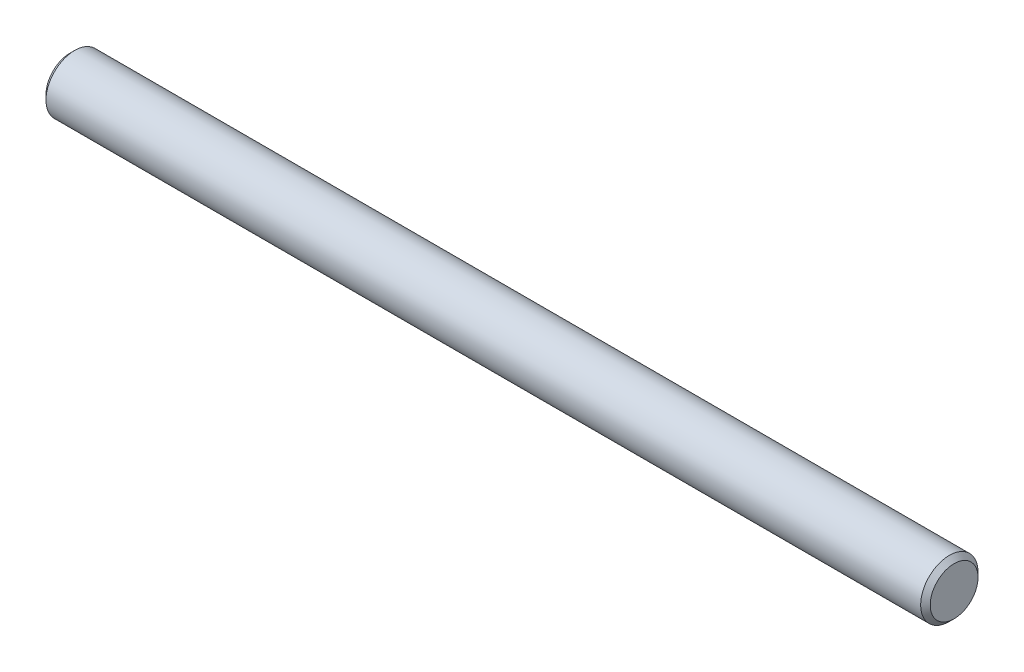
ISO-10303-21;
HEADER;
FILE_DESCRIPTION(('STEP AP214'),'2;1');
FILE_NAME('part.step','',(''),(''),'','','');
FILE_SCHEMA(('AUTOMOTIVE_DESIGN { 1 0 10303 214 1 1 1 1 }'));
ENDSEC;
DATA;
#1=APPLICATION_CONTEXT('core data for automotive mechanical design processes');
#2=APPLICATION_PROTOCOL_DEFINITION('international standard','automotive_design',2000,#1);
#3=PRODUCT_CONTEXT('',#1,'mechanical');
#4=PRODUCT('Part','Part','',(#3));
#5=PRODUCT_RELATED_PRODUCT_CATEGORY('part','',(#4));
#6=PRODUCT_DEFINITION_FORMATION('','',#4);
#7=PRODUCT_DEFINITION_CONTEXT('part definition',#1,'design');
#8=PRODUCT_DEFINITION('design','',#6,#7);
#9=PRODUCT_DEFINITION_SHAPE('','',#8);
#10=(LENGTH_UNIT() NAMED_UNIT(*) SI_UNIT(.MILLI.,.METRE.));
#11=(NAMED_UNIT(*) PLANE_ANGLE_UNIT() SI_UNIT($,.RADIAN.));
#12=(NAMED_UNIT(*) SI_UNIT($,.STERADIAN.) SOLID_ANGLE_UNIT());
#13=UNCERTAINTY_MEASURE_WITH_UNIT(LENGTH_MEASURE(1.E-05),#10,'distance_accuracy_value','');
#14=(GEOMETRIC_REPRESENTATION_CONTEXT(3) GLOBAL_UNCERTAINTY_ASSIGNED_CONTEXT((#13)) GLOBAL_UNIT_ASSIGNED_CONTEXT((#10,
#11,#12)) REPRESENTATION_CONTEXT('',''));
#15=CARTESIAN_POINT('',(0.,0.,0.));
#16=DIRECTION('',(0.,0.,1.));
#17=DIRECTION('',(1.,0.,0.));
#18=AXIS2_PLACEMENT_3D('',#15,#16,#17);
#19=CARTESIAN_POINT('',(0.,0.,0.));
#20=DIRECTION('',(-1.,0.,0.));
#21=DIRECTION('',(0.,0.,1.));
#22=AXIS2_PLACEMENT_3D('',#19,#20,#21);
#23=PLANE('',#22);
#24=CARTESIAN_POINT('',(0.,0.,0.));
#25=DIRECTION('',(-1.,0.,0.));
#26=DIRECTION('',(0.,0.,1.));
#27=AXIS2_PLACEMENT_3D('',#24,#25,#26);
#28=CIRCLE('',#27,4.99999999999995);
#29=CARTESIAN_POINT('',(0.,0.,4.99999999999995));
#30=VERTEX_POINT('',#29);
#31=EDGE_CURVE('E12',#30,#30,#28,.T.);
#32=ORIENTED_EDGE('',*,*,#31,.T.);
#33=EDGE_LOOP('',(#32));
#34=FACE_BOUND('',#33,.T.);
#35=ADVANCED_FACE('F48',(#34),#23,.T.);
#36=CARTESIAN_POINT('',(-265.537103044881,0.,0.));
#37=DIRECTION('',(-1.,0.,0.));
#38=DIRECTION('',(0.,0.,1.));
#39=AXIS2_PLACEMENT_3D('',#36,#37,#38);
#40=CYLINDRICAL_SURFACE('',#39,6.);
#41=CARTESIAN_POINT('',(184.,0.,0.));
#42=DIRECTION('',(1.,0.,0.));
#43=DIRECTION('',(0.,0.,-1.));
#44=AXIS2_PLACEMENT_3D('',#41,#42,#43);
#45=CIRCLE('',#44,6.);
#46=CARTESIAN_POINT('',(184.,0.,-6.));
#47=VERTEX_POINT('',#46);
#48=EDGE_CURVE('E59',#47,#47,#45,.F.);
#49=ORIENTED_EDGE('',*,*,#48,.T.);
#50=EDGE_LOOP('',(#49));
#51=FACE_BOUND('',#50,.T.);
#52=CARTESIAN_POINT('',(1.,0.,0.));
#53=DIRECTION('',(-1.,0.,0.));
#54=DIRECTION('',(0.,0.,1.));
#55=AXIS2_PLACEMENT_3D('',#52,#53,#54);
#56=CIRCLE('',#55,6.);
#57=CARTESIAN_POINT('',(1.,0.,6.));
#58=VERTEX_POINT('',#57);
#59=EDGE_CURVE('E63',#58,#58,#56,.F.);
#60=ORIENTED_EDGE('',*,*,#59,.T.);
#61=EDGE_LOOP('',(#60));
#62=FACE_BOUND('',#61,.T.);
#63=ADVANCED_FACE('F69',(#51,#62),#40,.T.);
#64=CARTESIAN_POINT('',(185.,0.,0.));
#65=DIRECTION('',(1.,0.,0.));
#66=DIRECTION('',(0.,0.,-1.));
#67=AXIS2_PLACEMENT_3D('',#64,#65,#66);
#68=PLANE('',#67);
#69=CARTESIAN_POINT('',(185.,0.,0.));
#70=DIRECTION('',(1.,0.,0.));
#71=DIRECTION('',(0.,0.,-1.));
#72=AXIS2_PLACEMENT_3D('',#69,#70,#71);
#73=CIRCLE('',#72,5.);
#74=CARTESIAN_POINT('',(185.,0.,-5.));
#75=VERTEX_POINT('',#74);
#76=EDGE_CURVE('E55',#75,#75,#73,.T.);
#77=ORIENTED_EDGE('',*,*,#76,.T.);
#78=EDGE_LOOP('',(#77));
#79=FACE_BOUND('',#78,.T.);
#80=ADVANCED_FACE('F77',(#79),#68,.T.);
#81=CARTESIAN_POINT('',(184.,0.,0.));
#82=DIRECTION('',(-1.,0.,0.));
#83=DIRECTION('',(0.,0.,1.));
#84=AXIS2_PLACEMENT_3D('',#81,#82,#83);
#85=CONICAL_SURFACE('',#84,6.,0.785398163397445);
#86=ORIENTED_EDGE('',*,*,#76,.F.);
#87=EDGE_LOOP('',(#86));
#88=FACE_BOUND('',#87,.T.);
#89=ORIENTED_EDGE('',*,*,#48,.F.);
#90=EDGE_LOOP('',(#89));
#91=FACE_BOUND('',#90,.T.);
#92=ADVANCED_FACE('F73',(#88,#91),#85,.T.);
#93=CARTESIAN_POINT('',(0.,0.,0.));
#94=DIRECTION('',(1.,0.,0.));
#95=DIRECTION('',(0.,0.,-1.));
#96=AXIS2_PLACEMENT_3D('',#93,#94,#95);
#97=CONICAL_SURFACE('',#96,4.99999999999995,0.785398163397473);
#98=ORIENTED_EDGE('',*,*,#59,.F.);
#99=EDGE_LOOP('',(#98));
#100=FACE_BOUND('',#99,.T.);
#101=ORIENTED_EDGE('',*,*,#31,.F.);
#102=EDGE_LOOP('',(#101));
#103=FACE_BOUND('',#102,.T.);
#104=ADVANCED_FACE('F50',(#100,#103),#97,.T.);
#105=CLOSED_SHELL('',(#35,#63,#80,#92,#104));
#106=MANIFOLD_SOLID_BREP('B2',#105);
#107=ADVANCED_BREP_SHAPE_REPRESENTATION('',(#18,#106),#14);
#108=SHAPE_DEFINITION_REPRESENTATION(#9,#107);
ENDSEC;
END-ISO-10303-21;
